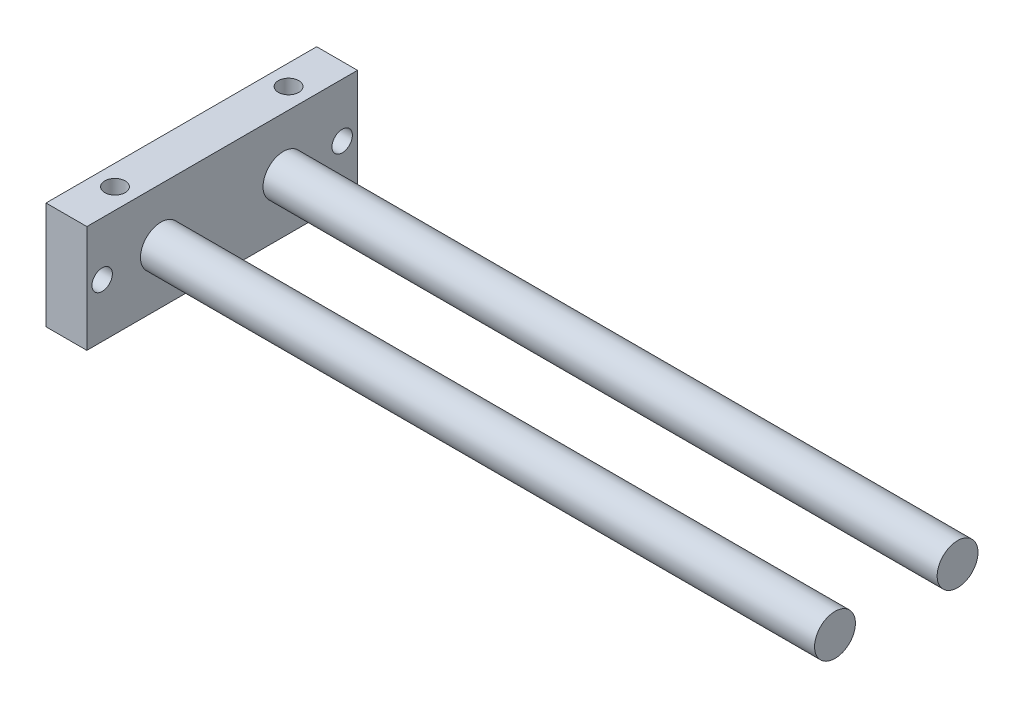
ISO-10303-21;
HEADER;
FILE_DESCRIPTION(('STEP AP214'),'2;1');
FILE_NAME('part.step','',(''),(''),'','','');
FILE_SCHEMA(('AUTOMOTIVE_DESIGN { 1 0 10303 214 1 1 1 1 }'));
ENDSEC;
DATA;
#1=APPLICATION_CONTEXT('core data for automotive mechanical design processes');
#2=APPLICATION_PROTOCOL_DEFINITION('international standard','automotive_design',2000,#1);
#3=PRODUCT_CONTEXT('',#1,'mechanical');
#4=PRODUCT('Part','Part','',(#3));
#5=PRODUCT_RELATED_PRODUCT_CATEGORY('part','',(#4));
#6=PRODUCT_DEFINITION_FORMATION('','',#4);
#7=PRODUCT_DEFINITION_CONTEXT('part definition',#1,'design');
#8=PRODUCT_DEFINITION('design','',#6,#7);
#9=PRODUCT_DEFINITION_SHAPE('','',#8);
#10=(LENGTH_UNIT() NAMED_UNIT(*) SI_UNIT(.MILLI.,.METRE.));
#11=(NAMED_UNIT(*) PLANE_ANGLE_UNIT() SI_UNIT($,.RADIAN.));
#12=(NAMED_UNIT(*) SI_UNIT($,.STERADIAN.) SOLID_ANGLE_UNIT());
#13=UNCERTAINTY_MEASURE_WITH_UNIT(LENGTH_MEASURE(1.E-05),#10,'distance_accuracy_value','');
#14=(GEOMETRIC_REPRESENTATION_CONTEXT(3) GLOBAL_UNCERTAINTY_ASSIGNED_CONTEXT((#13)) GLOBAL_UNIT_ASSIGNED_CONTEXT((#10,
#11,#12)) REPRESENTATION_CONTEXT('',''));
#15=CARTESIAN_POINT('',(0.,0.,0.));
#16=DIRECTION('',(0.,0.,1.));
#17=DIRECTION('',(1.,0.,0.));
#18=AXIS2_PLACEMENT_3D('',#15,#16,#17);
#19=CARTESIAN_POINT('',(8.,0.,0.));
#20=DIRECTION('',(-1.,0.,0.));
#21=DIRECTION('',(0.,0.,1.));
#22=AXIS2_PLACEMENT_3D('',#19,#20,#21);
#23=PLANE('',#22);
#24=CARTESIAN_POINT('',(8.00000000000001,10.5,-38.5));
#25=DIRECTION('',(-1.,0.,0.));
#26=DIRECTION('',(0.,0.,1.));
#27=AXIS2_PLACEMENT_3D('',#24,#25,#26);
#28=CIRCLE('',#27,4.00000000000001);
#29=CARTESIAN_POINT('',(8.00000000000001,10.5,-34.5));
#30=VERTEX_POINT('',#29);
#31=EDGE_CURVE('E44',#30,#30,#28,.F.);
#32=ORIENTED_EDGE('',*,*,#31,.F.);
#33=EDGE_LOOP('',(#32));
#34=FACE_BOUND('',#33,.T.);
#35=CARTESIAN_POINT('',(8.,10.5,-50.));
#36=DIRECTION('',(1.,0.,0.));
#37=DIRECTION('',(0.,0.,-1.));
#38=AXIS2_PLACEMENT_3D('',#35,#36,#37);
#39=CIRCLE('',#38,2.);
#40=CARTESIAN_POINT('',(8.,10.5,-52.));
#41=VERTEX_POINT('',#40);
#42=EDGE_CURVE('E106',#41,#41,#39,.T.);
#43=ORIENTED_EDGE('',*,*,#42,.F.);
#44=EDGE_LOOP('',(#43));
#45=FACE_BOUND('',#44,.T.);
#46=DIRECTION('',(0.,-1.,0.));
#47=VECTOR('',#46,1.);
#48=CARTESIAN_POINT('',(8.,0.,0.));
#49=LINE('',#48,#47);
#50=CARTESIAN_POINT('',(8.,21.,0.));
#51=VERTEX_POINT('',#50);
#52=CARTESIAN_POINT('',(8.,0.,0.));
#53=VERTEX_POINT('',#52);
#54=EDGE_CURVE('E88',#51,#53,#49,.T.);
#55=ORIENTED_EDGE('',*,*,#54,.T.);
#56=DIRECTION('',(0.,0.,-1.));
#57=VECTOR('',#56,1.);
#58=CARTESIAN_POINT('',(8.,0.,0.));
#59=LINE('',#58,#57);
#60=CARTESIAN_POINT('',(8.,0.,-53.));
#61=VERTEX_POINT('',#60);
#62=EDGE_CURVE('E83',#53,#61,#59,.T.);
#63=ORIENTED_EDGE('',*,*,#62,.T.);
#64=DIRECTION('',(0.,1.,0.));
#65=VECTOR('',#64,1.);
#66=CARTESIAN_POINT('',(8.,0.,-53.));
#67=LINE('',#66,#65);
#68=CARTESIAN_POINT('',(8.,21.,-53.));
#69=VERTEX_POINT('',#68);
#70=EDGE_CURVE('E86',#61,#69,#67,.T.);
#71=ORIENTED_EDGE('',*,*,#70,.T.);
#72=DIRECTION('',(0.,0.,1.));
#73=VECTOR('',#72,1.);
#74=CARTESIAN_POINT('',(8.,21.,0.));
#75=LINE('',#74,#73);
#76=EDGE_CURVE('E52',#69,#51,#75,.T.);
#77=ORIENTED_EDGE('',*,*,#76,.T.);
#78=EDGE_LOOP('',(#55,#63,#71,#77));
#79=FACE_BOUND('',#78,.T.);
#80=CARTESIAN_POINT('',(8.,10.5,-3.));
#81=DIRECTION('',(1.,0.,0.));
#82=DIRECTION('',(0.,0.,1.));
#83=AXIS2_PLACEMENT_3D('',#80,#81,#82);
#84=CIRCLE('',#83,2.);
#85=CARTESIAN_POINT('',(8.,10.5,-0.999999999999992));
#86=VERTEX_POINT('',#85);
#87=EDGE_CURVE('E127',#86,#86,#84,.T.);
#88=ORIENTED_EDGE('',*,*,#87,.F.);
#89=EDGE_LOOP('',(#88));
#90=FACE_BOUND('',#89,.T.);
#91=CARTESIAN_POINT('',(8.00000000000001,10.5,-14.5));
#92=DIRECTION('',(-1.,0.,0.));
#93=DIRECTION('',(0.,0.,1.));
#94=AXIS2_PLACEMENT_3D('',#91,#92,#93);
#95=CIRCLE('',#94,4.);
#96=CARTESIAN_POINT('',(8.00000000000001,10.5,-10.5));
#97=VERTEX_POINT('',#96);
#98=EDGE_CURVE('E11',#97,#97,#95,.F.);
#99=ORIENTED_EDGE('',*,*,#98,.F.);
#100=EDGE_LOOP('',(#99));
#101=FACE_BOUND('',#100,.T.);
#102=ADVANCED_FACE('F35',(#34,#45,#79,#90,#101),#23,.F.);
#103=CARTESIAN_POINT('',(0.,0.,0.));
#104=DIRECTION('',(-1.,0.,0.));
#105=DIRECTION('',(0.,0.,1.));
#106=AXIS2_PLACEMENT_3D('',#103,#104,#105);
#107=PLANE('',#106);
#108=CARTESIAN_POINT('',(0.,10.5,-38.5));
#109=DIRECTION('',(-1.,0.,0.));
#110=DIRECTION('',(0.,0.,-1.));
#111=AXIS2_PLACEMENT_3D('',#108,#109,#110);
#112=CIRCLE('',#111,4.);
#113=CARTESIAN_POINT('',(0.,10.5,-42.5));
#114=VERTEX_POINT('',#113);
#115=EDGE_CURVE('E142',#114,#114,#112,.T.);
#116=ORIENTED_EDGE('',*,*,#115,.F.);
#117=EDGE_LOOP('',(#116));
#118=FACE_BOUND('',#117,.T.);
#119=CARTESIAN_POINT('',(0.,10.5,-14.5));
#120=DIRECTION('',(-1.,0.,0.));
#121=DIRECTION('',(0.,0.,1.));
#122=AXIS2_PLACEMENT_3D('',#119,#120,#121);
#123=CIRCLE('',#122,4.);
#124=CARTESIAN_POINT('',(0.,10.5,-10.5));
#125=VERTEX_POINT('',#124);
#126=EDGE_CURVE('E136',#125,#125,#123,.T.);
#127=ORIENTED_EDGE('',*,*,#126,.F.);
#128=EDGE_LOOP('',(#127));
#129=FACE_BOUND('',#128,.T.);
#130=CARTESIAN_POINT('',(0.,10.5,-50.));
#131=DIRECTION('',(1.,0.,0.));
#132=DIRECTION('',(0.,0.,-1.));
#133=AXIS2_PLACEMENT_3D('',#130,#131,#132);
#134=CIRCLE('',#133,2.);
#135=CARTESIAN_POINT('',(0.,10.5,-52.));
#136=VERTEX_POINT('',#135);
#137=EDGE_CURVE('E124',#136,#136,#134,.T.);
#138=ORIENTED_EDGE('',*,*,#137,.T.);
#139=EDGE_LOOP('',(#138));
#140=FACE_BOUND('',#139,.T.);
#141=DIRECTION('',(0.,-1.,0.));
#142=VECTOR('',#141,1.);
#143=CARTESIAN_POINT('',(0.,0.,0.));
#144=LINE('',#143,#142);
#145=CARTESIAN_POINT('',(0.,21.,0.));
#146=VERTEX_POINT('',#145);
#147=CARTESIAN_POINT('',(0.,0.,0.));
#148=VERTEX_POINT('',#147);
#149=EDGE_CURVE('E103',#146,#148,#144,.T.);
#150=ORIENTED_EDGE('',*,*,#149,.F.);
#151=DIRECTION('',(0.,0.,1.));
#152=VECTOR('',#151,1.);
#153=CARTESIAN_POINT('',(0.,21.,0.));
#154=LINE('',#153,#152);
#155=CARTESIAN_POINT('',(0.,21.,-53.));
#156=VERTEX_POINT('',#155);
#157=EDGE_CURVE('E75',#156,#146,#154,.T.);
#158=ORIENTED_EDGE('',*,*,#157,.F.);
#159=DIRECTION('',(0.,1.,0.));
#160=VECTOR('',#159,1.);
#161=CARTESIAN_POINT('',(0.,0.,-53.));
#162=LINE('',#161,#160);
#163=CARTESIAN_POINT('',(0.,0.,-53.));
#164=VERTEX_POINT('',#163);
#165=EDGE_CURVE('E69',#164,#156,#162,.T.);
#166=ORIENTED_EDGE('',*,*,#165,.F.);
#167=DIRECTION('',(0.,0.,-1.));
#168=VECTOR('',#167,1.);
#169=CARTESIAN_POINT('',(0.,0.,0.));
#170=LINE('',#169,#168);
#171=EDGE_CURVE('E93',#148,#164,#170,.T.);
#172=ORIENTED_EDGE('',*,*,#171,.F.);
#173=EDGE_LOOP('',(#150,#158,#166,#172));
#174=FACE_BOUND('',#173,.T.);
#175=CARTESIAN_POINT('',(0.,10.5,-3.));
#176=DIRECTION('',(1.,0.,0.));
#177=DIRECTION('',(0.,0.,1.));
#178=AXIS2_PLACEMENT_3D('',#175,#176,#177);
#179=CIRCLE('',#178,2.);
#180=CARTESIAN_POINT('',(0.,10.5,-0.999999999999992));
#181=VERTEX_POINT('',#180);
#182=EDGE_CURVE('E130',#181,#181,#179,.T.);
#183=ORIENTED_EDGE('',*,*,#182,.T.);
#184=EDGE_LOOP('',(#183));
#185=FACE_BOUND('',#184,.T.);
#186=ADVANCED_FACE('F119',(#118,#129,#140,#174,#185),#107,.T.);
#187=CARTESIAN_POINT('',(8.,0.,0.));
#188=DIRECTION('',(0.,0.,-1.));
#189=DIRECTION('',(0.,1.,0.));
#190=AXIS2_PLACEMENT_3D('',#187,#188,#189);
#191=PLANE('',#190);
#192=ORIENTED_EDGE('',*,*,#149,.T.);
#193=DIRECTION('',(-1.,0.,0.));
#194=VECTOR('',#193,1.);
#195=CARTESIAN_POINT('',(8.,0.,0.));
#196=LINE('',#195,#194);
#197=EDGE_CURVE('E94',#53,#148,#196,.T.);
#198=ORIENTED_EDGE('',*,*,#197,.F.);
#199=ORIENTED_EDGE('',*,*,#54,.F.);
#200=DIRECTION('',(-1.,0.,0.));
#201=VECTOR('',#200,1.);
#202=CARTESIAN_POINT('',(8.,21.,0.));
#203=LINE('',#202,#201);
#204=EDGE_CURVE('E99',#51,#146,#203,.T.);
#205=ORIENTED_EDGE('',*,*,#204,.T.);
#206=EDGE_LOOP('',(#192,#198,#199,#205));
#207=FACE_BOUND('',#206,.T.);
#208=ADVANCED_FACE('F37',(#207),#191,.F.);
#209=CARTESIAN_POINT('',(8.,0.,0.));
#210=DIRECTION('',(0.,1.,0.));
#211=DIRECTION('',(0.,0.,1.));
#212=AXIS2_PLACEMENT_3D('',#209,#210,#211);
#213=PLANE('',#212);
#214=ORIENTED_EDGE('',*,*,#171,.T.);
#215=DIRECTION('',(-1.,0.,0.));
#216=VECTOR('',#215,1.);
#217=CARTESIAN_POINT('',(8.,0.,-53.));
#218=LINE('',#217,#216);
#219=EDGE_CURVE('E91',#61,#164,#218,.T.);
#220=ORIENTED_EDGE('',*,*,#219,.F.);
#221=ORIENTED_EDGE('',*,*,#62,.F.);
#222=ORIENTED_EDGE('',*,*,#197,.T.);
#223=EDGE_LOOP('',(#214,#220,#221,#222));
#224=FACE_BOUND('',#223,.T.);
#225=ADVANCED_FACE('F92',(#224),#213,.F.);
#226=CARTESIAN_POINT('',(8.,0.,-53.));
#227=DIRECTION('',(0.,0.,1.));
#228=DIRECTION('',(0.,-1.,0.));
#229=AXIS2_PLACEMENT_3D('',#226,#227,#228);
#230=PLANE('',#229);
#231=ORIENTED_EDGE('',*,*,#165,.T.);
#232=DIRECTION('',(-1.,0.,0.));
#233=VECTOR('',#232,1.);
#234=CARTESIAN_POINT('',(8.,21.,-53.));
#235=LINE('',#234,#233);
#236=EDGE_CURVE('E95',#69,#156,#235,.T.);
#237=ORIENTED_EDGE('',*,*,#236,.F.);
#238=ORIENTED_EDGE('',*,*,#70,.F.);
#239=ORIENTED_EDGE('',*,*,#219,.T.);
#240=EDGE_LOOP('',(#231,#237,#238,#239));
#241=FACE_BOUND('',#240,.T.);
#242=ADVANCED_FACE('F97',(#241),#230,.F.);
#243=CARTESIAN_POINT('',(8.,21.,0.));
#244=DIRECTION('',(0.,-1.,0.));
#245=DIRECTION('',(0.,0.,-1.));
#246=AXIS2_PLACEMENT_3D('',#243,#244,#245);
#247=PLANE('',#246);
#248=CARTESIAN_POINT('',(4.,21.,-9.49999999999999));
#249=DIRECTION('',(0.,1.,0.));
#250=DIRECTION('',(0.,0.,-1.));
#251=AXIS2_PLACEMENT_3D('',#248,#249,#250);
#252=CIRCLE('',#251,2.);
#253=CARTESIAN_POINT('',(4.,21.,-11.5));
#254=VERTEX_POINT('',#253);
#255=EDGE_CURVE('E160',#254,#254,#252,.T.);
#256=ORIENTED_EDGE('',*,*,#255,.F.);
#257=EDGE_LOOP('',(#256));
#258=FACE_BOUND('',#257,.T.);
#259=CARTESIAN_POINT('',(4.,21.,-43.5));
#260=DIRECTION('',(0.,1.,0.));
#261=DIRECTION('',(0.,0.,1.));
#262=AXIS2_PLACEMENT_3D('',#259,#260,#261);
#263=CIRCLE('',#262,2.);
#264=CARTESIAN_POINT('',(4.,21.,-41.5));
#265=VERTEX_POINT('',#264);
#266=EDGE_CURVE('E154',#265,#265,#263,.T.);
#267=ORIENTED_EDGE('',*,*,#266,.F.);
#268=EDGE_LOOP('',(#267));
#269=FACE_BOUND('',#268,.T.);
#270=ORIENTED_EDGE('',*,*,#157,.T.);
#271=ORIENTED_EDGE('',*,*,#204,.F.);
#272=ORIENTED_EDGE('',*,*,#76,.F.);
#273=ORIENTED_EDGE('',*,*,#236,.T.);
#274=EDGE_LOOP('',(#270,#271,#272,#273));
#275=FACE_BOUND('',#274,.T.);
#276=ADVANCED_FACE('F175',(#258,#269,#275),#247,.F.);
#277=CARTESIAN_POINT('',(8.,10.5,-50.));
#278=DIRECTION('',(-1.,0.,0.));
#279=DIRECTION('',(0.,0.,1.));
#280=AXIS2_PLACEMENT_3D('',#277,#278,#279);
#281=CYLINDRICAL_SURFACE('',#280,2.);
#282=ORIENTED_EDGE('',*,*,#42,.T.);
#283=EDGE_LOOP('',(#282));
#284=FACE_BOUND('',#283,.T.);
#285=ORIENTED_EDGE('',*,*,#137,.F.);
#286=EDGE_LOOP('',(#285));
#287=FACE_BOUND('',#286,.T.);
#288=ADVANCED_FACE('F178',(#284,#287),#281,.F.);
#289=CARTESIAN_POINT('',(8.,10.5,-3.));
#290=DIRECTION('',(-1.,0.,0.));
#291=DIRECTION('',(0.,0.,1.));
#292=AXIS2_PLACEMENT_3D('',#289,#290,#291);
#293=CYLINDRICAL_SURFACE('',#292,2.);
#294=ORIENTED_EDGE('',*,*,#87,.T.);
#295=EDGE_LOOP('',(#294));
#296=FACE_BOUND('',#295,.T.);
#297=ORIENTED_EDGE('',*,*,#182,.F.);
#298=EDGE_LOOP('',(#297));
#299=FACE_BOUND('',#298,.T.);
#300=ADVANCED_FACE('F223',(#296,#299),#293,.F.);
#301=CARTESIAN_POINT('',(5.,10.5,-14.5));
#302=DIRECTION('',(-1.,0.,0.));
#303=DIRECTION('',(0.,0.,1.));
#304=AXIS2_PLACEMENT_3D('',#301,#302,#303);
#305=CYLINDRICAL_SURFACE('',#304,4.);
#306=CARTESIAN_POINT('',(5.,10.5,-14.5));
#307=DIRECTION('',(-1.,0.,0.));
#308=DIRECTION('',(0.,0.,1.));
#309=AXIS2_PLACEMENT_3D('',#306,#307,#308);
#310=CIRCLE('',#309,4.);
#311=CARTESIAN_POINT('',(5.,10.5,-10.5));
#312=VERTEX_POINT('',#311);
#313=EDGE_CURVE('E133',#312,#312,#310,.T.);
#314=ORIENTED_EDGE('',*,*,#313,.F.);
#315=EDGE_LOOP('',(#314));
#316=FACE_BOUND('',#315,.T.);
#317=ORIENTED_EDGE('',*,*,#126,.T.);
#318=EDGE_LOOP('',(#317));
#319=FACE_BOUND('',#318,.T.);
#320=ADVANCED_FACE('F219',(#316,#319),#305,.F.);
#321=CARTESIAN_POINT('',(5.,10.5,-14.5));
#322=DIRECTION('',(-1.,0.,0.));
#323=DIRECTION('',(0.,0.,1.));
#324=AXIS2_PLACEMENT_3D('',#321,#322,#323);
#325=PLANE('',#324);
#326=ORIENTED_EDGE('',*,*,#313,.T.);
#327=EDGE_LOOP('',(#326));
#328=FACE_BOUND('',#327,.T.);
#329=ADVANCED_FACE('F215',(#328),#325,.T.);
#330=CARTESIAN_POINT('',(5.,10.5,-38.5));
#331=DIRECTION('',(-1.,0.,0.));
#332=DIRECTION('',(0.,0.,1.));
#333=AXIS2_PLACEMENT_3D('',#330,#331,#332);
#334=CYLINDRICAL_SURFACE('',#333,4.);
#335=CARTESIAN_POINT('',(5.,10.5,-38.5));
#336=DIRECTION('',(-1.,0.,0.));
#337=DIRECTION('',(0.,0.,-1.));
#338=AXIS2_PLACEMENT_3D('',#335,#336,#337);
#339=CIRCLE('',#338,4.);
#340=CARTESIAN_POINT('',(5.,10.5,-42.5));
#341=VERTEX_POINT('',#340);
#342=EDGE_CURVE('E139',#341,#341,#339,.T.);
#343=ORIENTED_EDGE('',*,*,#342,.F.);
#344=EDGE_LOOP('',(#343));
#345=FACE_BOUND('',#344,.T.);
#346=ORIENTED_EDGE('',*,*,#115,.T.);
#347=EDGE_LOOP('',(#346));
#348=FACE_BOUND('',#347,.T.);
#349=ADVANCED_FACE('F211',(#345,#348),#334,.F.);
#350=CARTESIAN_POINT('',(5.,10.5,-38.5));
#351=DIRECTION('',(1.,0.,0.));
#352=DIRECTION('',(0.,0.,-1.));
#353=AXIS2_PLACEMENT_3D('',#350,#351,#352);
#354=PLANE('',#353);
#355=ORIENTED_EDGE('',*,*,#342,.T.);
#356=EDGE_LOOP('',(#355));
#357=FACE_BOUND('',#356,.T.);
#358=ADVANCED_FACE('F207',(#357),#354,.F.);
#359=CARTESIAN_POINT('',(140.,10.5,-38.5));
#360=DIRECTION('',(-1.,0.,0.));
#361=DIRECTION('',(0.,0.,1.));
#362=AXIS2_PLACEMENT_3D('',#359,#360,#361);
#363=CYLINDRICAL_SURFACE('',#362,4.00000000000001);
#364=CARTESIAN_POINT('',(140.,10.5,-38.5));
#365=DIRECTION('',(1.,0.,0.));
#366=DIRECTION('',(0.,0.,-1.));
#367=AXIS2_PLACEMENT_3D('',#364,#365,#366);
#368=CIRCLE('',#367,4.00000000000001);
#369=CARTESIAN_POINT('',(140.,10.5,-42.5));
#370=VERTEX_POINT('',#369);
#371=EDGE_CURVE('E145',#370,#370,#368,.T.);
#372=ORIENTED_EDGE('',*,*,#371,.F.);
#373=EDGE_LOOP('',(#372));
#374=FACE_BOUND('',#373,.T.);
#375=ORIENTED_EDGE('',*,*,#31,.T.);
#376=EDGE_LOOP('',(#375));
#377=FACE_BOUND('',#376,.T.);
#378=ADVANCED_FACE('F115',(#374,#377),#363,.T.);
#379=CARTESIAN_POINT('',(140.,10.5,-38.5));
#380=DIRECTION('',(1.,0.,0.));
#381=DIRECTION('',(0.,0.,-1.));
#382=AXIS2_PLACEMENT_3D('',#379,#380,#381);
#383=PLANE('',#382);
#384=ORIENTED_EDGE('',*,*,#371,.T.);
#385=EDGE_LOOP('',(#384));
#386=FACE_BOUND('',#385,.T.);
#387=ADVANCED_FACE('F200',(#386),#383,.T.);
#388=CARTESIAN_POINT('',(140.,10.5,-14.5));
#389=DIRECTION('',(-1.,0.,0.));
#390=DIRECTION('',(0.,0.,1.));
#391=AXIS2_PLACEMENT_3D('',#388,#389,#390);
#392=CYLINDRICAL_SURFACE('',#391,4.);
#393=CARTESIAN_POINT('',(140.,10.5,-14.5));
#394=DIRECTION('',(1.,0.,0.));
#395=DIRECTION('',(0.,0.,1.));
#396=AXIS2_PLACEMENT_3D('',#393,#394,#395);
#397=CIRCLE('',#396,4.);
#398=CARTESIAN_POINT('',(140.,10.5,-10.5));
#399=VERTEX_POINT('',#398);
#400=EDGE_CURVE('E150',#399,#399,#397,.T.);
#401=ORIENTED_EDGE('',*,*,#400,.F.);
#402=EDGE_LOOP('',(#401));
#403=FACE_BOUND('',#402,.T.);
#404=ORIENTED_EDGE('',*,*,#98,.T.);
#405=EDGE_LOOP('',(#404));
#406=FACE_BOUND('',#405,.T.);
#407=ADVANCED_FACE('F193',(#403,#406),#392,.T.);
#408=CARTESIAN_POINT('',(140.,10.5,-14.5));
#409=DIRECTION('',(-1.,0.,0.));
#410=DIRECTION('',(0.,0.,1.));
#411=AXIS2_PLACEMENT_3D('',#408,#409,#410);
#412=PLANE('',#411);
#413=ORIENTED_EDGE('',*,*,#400,.T.);
#414=EDGE_LOOP('',(#413));
#415=FACE_BOUND('',#414,.T.);
#416=ADVANCED_FACE('F184',(#415),#412,.F.);
#417=CARTESIAN_POINT('',(4.,16.,-43.5));
#418=DIRECTION('',(0.,1.,0.));
#419=DIRECTION('',(0.,0.,1.));
#420=AXIS2_PLACEMENT_3D('',#417,#418,#419);
#421=CYLINDRICAL_SURFACE('',#420,2.);
#422=CARTESIAN_POINT('',(4.,16.,-43.5));
#423=DIRECTION('',(0.,1.,0.));
#424=DIRECTION('',(0.,0.,1.));
#425=AXIS2_PLACEMENT_3D('',#422,#423,#424);
#426=CIRCLE('',#425,2.);
#427=CARTESIAN_POINT('',(4.,16.,-41.5));
#428=VERTEX_POINT('',#427);
#429=EDGE_CURVE('E153',#428,#428,#426,.T.);
#430=ORIENTED_EDGE('',*,*,#429,.F.);
#431=EDGE_LOOP('',(#430));
#432=FACE_BOUND('',#431,.T.);
#433=ORIENTED_EDGE('',*,*,#266,.T.);
#434=EDGE_LOOP('',(#433));
#435=FACE_BOUND('',#434,.T.);
#436=ADVANCED_FACE('F182',(#432,#435),#421,.F.);
#437=CARTESIAN_POINT('',(4.,16.,-43.5));
#438=DIRECTION('',(0.,1.,0.));
#439=DIRECTION('',(0.,0.,1.));
#440=AXIS2_PLACEMENT_3D('',#437,#438,#439);
#441=PLANE('',#440);
#442=ORIENTED_EDGE('',*,*,#429,.T.);
#443=EDGE_LOOP('',(#442));
#444=FACE_BOUND('',#443,.T.);
#445=ADVANCED_FACE('F171',(#444),#441,.T.);
#446=CARTESIAN_POINT('',(4.,16.,-9.49999999999999));
#447=DIRECTION('',(0.,1.,0.));
#448=DIRECTION('',(0.,0.,1.));
#449=AXIS2_PLACEMENT_3D('',#446,#447,#448);
#450=CYLINDRICAL_SURFACE('',#449,2.);
#451=CARTESIAN_POINT('',(4.,16.,-9.49999999999999));
#452=DIRECTION('',(0.,1.,0.));
#453=DIRECTION('',(0.,0.,-1.));
#454=AXIS2_PLACEMENT_3D('',#451,#452,#453);
#455=CIRCLE('',#454,2.);
#456=CARTESIAN_POINT('',(4.,16.,-11.5));
#457=VERTEX_POINT('',#456);
#458=EDGE_CURVE('E157',#457,#457,#455,.T.);
#459=ORIENTED_EDGE('',*,*,#458,.F.);
#460=EDGE_LOOP('',(#459));
#461=FACE_BOUND('',#460,.T.);
#462=ORIENTED_EDGE('',*,*,#255,.T.);
#463=EDGE_LOOP('',(#462));
#464=FACE_BOUND('',#463,.T.);
#465=ADVANCED_FACE('F168',(#461,#464),#450,.F.);
#466=CARTESIAN_POINT('',(4.,16.,-9.49999999999999));
#467=DIRECTION('',(0.,-1.,0.));
#468=DIRECTION('',(0.,0.,-1.));
#469=AXIS2_PLACEMENT_3D('',#466,#467,#468);
#470=PLANE('',#469);
#471=ORIENTED_EDGE('',*,*,#458,.T.);
#472=EDGE_LOOP('',(#471));
#473=FACE_BOUND('',#472,.T.);
#474=ADVANCED_FACE('F166',(#473),#470,.F.);
#475=CLOSED_SHELL('',(#102,#186,#208,#225,#242,#276,#288,#300,#320,#329,#349,#358,#378,#387,
#407,#416,#436,#445,#465,#474));
#476=MANIFOLD_SOLID_BREP('B2',#475);
#477=ADVANCED_BREP_SHAPE_REPRESENTATION('',(#18,#476),#14);
#478=SHAPE_DEFINITION_REPRESENTATION(#9,#477);
ENDSEC;
END-ISO-10303-21;
